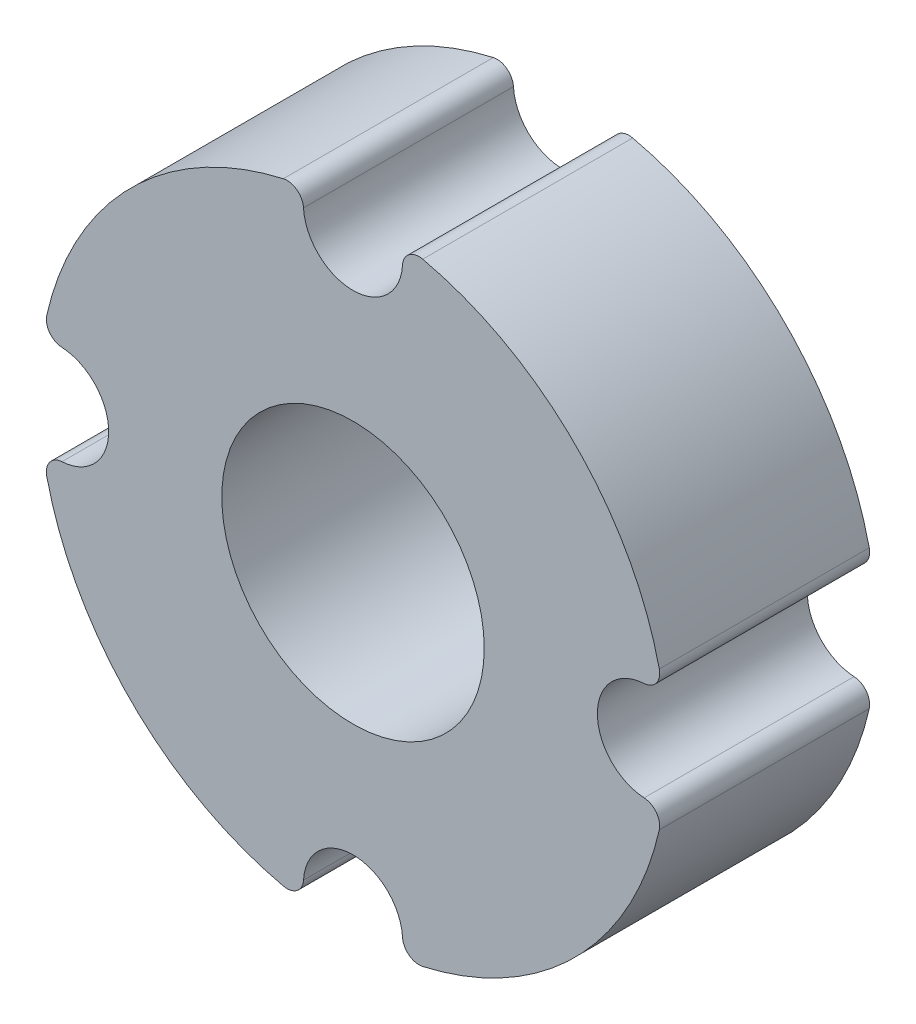
ISO-10303-21;
HEADER;
FILE_DESCRIPTION(('STEP AP214'),'2;1');
FILE_NAME('part.step','',(''),(''),'','','');
FILE_SCHEMA(('AUTOMOTIVE_DESIGN { 1 0 10303 214 1 1 1 1 }'));
ENDSEC;
DATA;
#1=APPLICATION_CONTEXT('core data for automotive mechanical design processes');
#2=APPLICATION_PROTOCOL_DEFINITION('international standard','automotive_design',2000,#1);
#3=PRODUCT_CONTEXT('',#1,'mechanical');
#4=PRODUCT('Part','Part','',(#3));
#5=PRODUCT_RELATED_PRODUCT_CATEGORY('part','',(#4));
#6=PRODUCT_DEFINITION_FORMATION('','',#4);
#7=PRODUCT_DEFINITION_CONTEXT('part definition',#1,'design');
#8=PRODUCT_DEFINITION('design','',#6,#7);
#9=PRODUCT_DEFINITION_SHAPE('','',#8);
#10=(LENGTH_UNIT() NAMED_UNIT(*) SI_UNIT(.MILLI.,.METRE.));
#11=(NAMED_UNIT(*) PLANE_ANGLE_UNIT() SI_UNIT($,.RADIAN.));
#12=(NAMED_UNIT(*) SI_UNIT($,.STERADIAN.) SOLID_ANGLE_UNIT());
#13=UNCERTAINTY_MEASURE_WITH_UNIT(LENGTH_MEASURE(1.E-05),#10,'distance_accuracy_value','');
#14=(GEOMETRIC_REPRESENTATION_CONTEXT(3) GLOBAL_UNCERTAINTY_ASSIGNED_CONTEXT((#13)) GLOBAL_UNIT_ASSIGNED_CONTEXT((#10,
#11,#12)) REPRESENTATION_CONTEXT('',''));
#15=CARTESIAN_POINT('',(0.,0.,0.));
#16=DIRECTION('',(0.,0.,1.));
#17=DIRECTION('',(1.,0.,0.));
#18=AXIS2_PLACEMENT_3D('',#15,#16,#17);
#19=CARTESIAN_POINT('',(0.,0.,6.35));
#20=DIRECTION('',(0.,0.,-1.));
#21=DIRECTION('',(-1.,0.,0.));
#22=AXIS2_PLACEMENT_3D('',#19,#20,#21);
#23=CYLINDRICAL_SURFACE('',#22,9.5);
#24=CARTESIAN_POINT('',(0.,0.,6.35));
#25=DIRECTION('',(0.,0.,1.));
#26=DIRECTION('',(1.,0.,0.));
#27=AXIS2_PLACEMENT_3D('',#24,#25,#26);
#28=CIRCLE('',#27,9.5);
#29=CARTESIAN_POINT('',(2.10766124104048,-9.26324803149606,6.35));
#30=VERTEX_POINT('',#29);
#31=CARTESIAN_POINT('',(9.26324803149608,-2.10766124104039,6.35));
#32=VERTEX_POINT('',#31);
#33=EDGE_CURVE('E174',#30,#32,#28,.T.);
#34=ORIENTED_EDGE('',*,*,#33,.F.);
#35=DIRECTION('',(0.,0.,-1.));
#36=VECTOR('',#35,1.);
#37=CARTESIAN_POINT('',(2.10766124104048,-9.26324803149607,6.35));
#38=LINE('',#37,#36);
#39=CARTESIAN_POINT('',(2.10766124104048,-9.26324803149606,0.));
#40=VERTEX_POINT('',#39);
#41=EDGE_CURVE('E158',#30,#40,#38,.T.);
#42=ORIENTED_EDGE('',*,*,#41,.T.);
#43=CARTESIAN_POINT('',(0.,0.,0.));
#44=DIRECTION('',(0.,0.,1.));
#45=DIRECTION('',(1.,0.,0.));
#46=AXIS2_PLACEMENT_3D('',#43,#44,#45);
#47=CIRCLE('',#46,9.5);
#48=CARTESIAN_POINT('',(9.26324803149608,-2.10766124104039,0.));
#49=VERTEX_POINT('',#48);
#50=EDGE_CURVE('E171',#40,#49,#47,.T.);
#51=ORIENTED_EDGE('',*,*,#50,.T.);
#52=DIRECTION('',(0.,0.,-1.));
#53=VECTOR('',#52,1.);
#54=CARTESIAN_POINT('',(9.26324803149608,-2.10766124104039,6.35));
#55=LINE('',#54,#53);
#56=EDGE_CURVE('E176',#49,#32,#55,.F.);
#57=ORIENTED_EDGE('',*,*,#56,.T.);
#58=EDGE_LOOP('',(#34,#42,#51,#57));
#59=FACE_BOUND('',#58,.T.);
#60=ADVANCED_FACE('F39',(#59),#23,.T.);
#61=CARTESIAN_POINT('',(-9.26324803149606,-2.10766124104052,0.));
#62=VERTEX_POINT('',#61);
#63=CARTESIAN_POINT('',(-2.10766124104048,-9.26324803149606,0.));
#64=VERTEX_POINT('',#63);
#65=EDGE_CURVE('E183',#62,#64,#47,.T.);
#66=ORIENTED_EDGE('',*,*,#65,.T.);
#67=DIRECTION('',(0.,0.,-1.));
#68=VECTOR('',#67,1.);
#69=CARTESIAN_POINT('',(-2.10766124104048,-9.26324803149607,6.35));
#70=LINE('',#69,#68);
#71=CARTESIAN_POINT('',(-2.10766124104048,-9.26324803149606,6.35));
#72=VERTEX_POINT('',#71);
#73=EDGE_CURVE('E219',#64,#72,#70,.F.);
#74=ORIENTED_EDGE('',*,*,#73,.T.);
#75=CARTESIAN_POINT('',(-9.26324803149606,-2.10766124104052,6.35));
#76=VERTEX_POINT('',#75);
#77=EDGE_CURVE('E202',#76,#72,#28,.T.);
#78=ORIENTED_EDGE('',*,*,#77,.F.);
#79=DIRECTION('',(0.,0.,-1.));
#80=VECTOR('',#79,1.);
#81=CARTESIAN_POINT('',(-9.26324803149606,-2.10766124104052,6.35));
#82=LINE('',#81,#80);
#83=EDGE_CURVE('E217',#76,#62,#82,.T.);
#84=ORIENTED_EDGE('',*,*,#83,.T.);
#85=EDGE_LOOP('',(#66,#74,#78,#84));
#86=FACE_BOUND('',#85,.T.);
#87=ADVANCED_FACE('F216',(#86),#23,.T.);
#88=CARTESIAN_POINT('',(-2.10766124104048,9.26324803149606,0.));
#89=VERTEX_POINT('',#88);
#90=CARTESIAN_POINT('',(-9.26324803149607,2.10766124104045,0.));
#91=VERTEX_POINT('',#90);
#92=EDGE_CURVE('E186',#89,#91,#47,.T.);
#93=ORIENTED_EDGE('',*,*,#92,.T.);
#94=DIRECTION('',(0.,0.,-1.));
#95=VECTOR('',#94,1.);
#96=CARTESIAN_POINT('',(-9.26324803149607,2.10766124104045,6.35));
#97=LINE('',#96,#95);
#98=CARTESIAN_POINT('',(-9.26324803149607,2.10766124104045,6.35));
#99=VERTEX_POINT('',#98);
#100=EDGE_CURVE('E232',#91,#99,#97,.F.);
#101=ORIENTED_EDGE('',*,*,#100,.T.);
#102=CARTESIAN_POINT('',(-2.10766124104048,9.26324803149606,6.35));
#103=VERTEX_POINT('',#102);
#104=EDGE_CURVE('E200',#103,#99,#28,.T.);
#105=ORIENTED_EDGE('',*,*,#104,.F.);
#106=DIRECTION('',(0.,0.,-1.));
#107=VECTOR('',#106,1.);
#108=CARTESIAN_POINT('',(-2.10766124104048,9.26324803149607,6.35));
#109=LINE('',#108,#107);
#110=EDGE_CURVE('E226',#103,#89,#109,.T.);
#111=ORIENTED_EDGE('',*,*,#110,.T.);
#112=EDGE_LOOP('',(#93,#101,#105,#111));
#113=FACE_BOUND('',#112,.T.);
#114=ADVANCED_FACE('F311',(#113),#23,.T.);
#115=CARTESIAN_POINT('',(0.,0.,6.35));
#116=DIRECTION('',(0.,0.,1.));
#117=DIRECTION('',(1.,0.,0.));
#118=AXIS2_PLACEMENT_3D('',#115,#116,#117);
#119=PLANE('',#118);
#120=CARTESIAN_POINT('',(0.,-8.89,6.35));
#121=DIRECTION('',(0.,0.,1.));
#122=DIRECTION('',(1.,0.,0.));
#123=AXIS2_PLACEMENT_3D('',#120,#121,#122);
#124=CIRCLE('',#123,1.5);
#125=CARTESIAN_POINT('',(1.49754877652876,-8.80428149606299,6.35));
#126=VERTEX_POINT('',#125);
#127=CARTESIAN_POINT('',(-1.49754877652876,-8.80428149606299,6.35));
#128=VERTEX_POINT('',#127);
#129=EDGE_CURVE('E291',#126,#128,#124,.T.);
#130=ORIENTED_EDGE('',*,*,#129,.F.);
#131=CARTESIAN_POINT('',(1.99673170203835,-8.77570866141732,6.35));
#132=DIRECTION('',(0.,0.,1.));
#133=DIRECTION('',(1.,0.,0.));
#134=AXIS2_PLACEMENT_3D('',#131,#132,#133);
#135=CIRCLE('',#134,0.5);
#136=EDGE_CURVE('E224',#126,#30,#135,.T.);
#137=ORIENTED_EDGE('',*,*,#136,.T.);
#138=ORIENTED_EDGE('',*,*,#33,.T.);
#139=CARTESIAN_POINT('',(8.77570866141734,-1.99673170203826,6.35));
#140=DIRECTION('',(0.,0.,1.));
#141=DIRECTION('',(1.,0.,0.));
#142=AXIS2_PLACEMENT_3D('',#139,#140,#141);
#143=CIRCLE('',#142,0.5);
#144=CARTESIAN_POINT('',(8.80428149606301,-1.49754877652867,6.35));
#145=VERTEX_POINT('',#144);
#146=EDGE_CURVE('E271',#32,#145,#143,.T.);
#147=ORIENTED_EDGE('',*,*,#146,.T.);
#148=CARTESIAN_POINT('',(8.89,0.,6.35));
#149=DIRECTION('',(0.,0.,1.));
#150=DIRECTION('',(1.,0.,0.));
#151=AXIS2_PLACEMENT_3D('',#148,#149,#150);
#152=CIRCLE('',#151,1.5);
#153=CARTESIAN_POINT('',(8.80428149606298,1.49754877652886,6.35));
#154=VERTEX_POINT('',#153);
#155=EDGE_CURVE('E341',#154,#145,#152,.T.);
#156=ORIENTED_EDGE('',*,*,#155,.F.);
#157=CARTESIAN_POINT('',(8.7757086614173,1.99673170203844,6.35));
#158=DIRECTION('',(0.,0.,1.));
#159=DIRECTION('',(1.,0.,0.));
#160=AXIS2_PLACEMENT_3D('',#157,#158,#159);
#161=CIRCLE('',#160,0.5);
#162=CARTESIAN_POINT('',(9.26324803149604,2.10766124104058,6.35));
#163=VERTEX_POINT('',#162);
#164=EDGE_CURVE('E265',#154,#163,#161,.T.);
#165=ORIENTED_EDGE('',*,*,#164,.T.);
#166=CARTESIAN_POINT('',(2.10766124104048,9.26324803149606,6.35));
#167=VERTEX_POINT('',#166);
#168=EDGE_CURVE('E193',#163,#167,#28,.T.);
#169=ORIENTED_EDGE('',*,*,#168,.T.);
#170=CARTESIAN_POINT('',(1.99673170203835,8.77570866141732,6.35));
#171=DIRECTION('',(0.,0.,1.));
#172=DIRECTION('',(1.,0.,0.));
#173=AXIS2_PLACEMENT_3D('',#170,#171,#172);
#174=CIRCLE('',#173,0.5);
#175=CARTESIAN_POINT('',(1.49754877652876,8.80428149606299,6.35));
#176=VERTEX_POINT('',#175);
#177=EDGE_CURVE('E260',#167,#176,#174,.T.);
#178=ORIENTED_EDGE('',*,*,#177,.T.);
#179=CARTESIAN_POINT('',(0.,8.89,6.35));
#180=DIRECTION('',(0.,0.,1.));
#181=DIRECTION('',(1.,0.,0.));
#182=AXIS2_PLACEMENT_3D('',#179,#180,#181);
#183=CIRCLE('',#182,1.5);
#184=CARTESIAN_POINT('',(-1.49754877652876,8.80428149606299,6.35));
#185=VERTEX_POINT('',#184);
#186=EDGE_CURVE('E253',#185,#176,#183,.T.);
#187=ORIENTED_EDGE('',*,*,#186,.F.);
#188=CARTESIAN_POINT('',(-1.99673170203835,8.77570866141732,6.35));
#189=DIRECTION('',(0.,0.,1.));
#190=DIRECTION('',(1.,0.,0.));
#191=AXIS2_PLACEMENT_3D('',#188,#189,#190);
#192=CIRCLE('',#191,0.5);
#193=EDGE_CURVE('E259',#185,#103,#192,.T.);
#194=ORIENTED_EDGE('',*,*,#193,.T.);
#195=ORIENTED_EDGE('',*,*,#104,.T.);
#196=CARTESIAN_POINT('',(-8.77570866141733,1.99673170203832,6.35));
#197=DIRECTION('',(0.,0.,1.));
#198=DIRECTION('',(1.,0.,0.));
#199=AXIS2_PLACEMENT_3D('',#196,#197,#198);
#200=CIRCLE('',#199,0.5);
#201=CARTESIAN_POINT('',(-8.804281496063,1.49754877652873,6.35));
#202=VERTEX_POINT('',#201);
#203=EDGE_CURVE('E274',#99,#202,#200,.T.);
#204=ORIENTED_EDGE('',*,*,#203,.T.);
#205=CARTESIAN_POINT('',(-8.89,0.,6.35));
#206=DIRECTION('',(0.,0.,1.));
#207=DIRECTION('',(1.,0.,0.));
#208=AXIS2_PLACEMENT_3D('',#205,#206,#207);
#209=CIRCLE('',#208,1.5);
#210=CARTESIAN_POINT('',(-8.80428149606299,-1.4975487765288,6.35));
#211=VERTEX_POINT('',#210);
#212=EDGE_CURVE('E205',#211,#202,#209,.T.);
#213=ORIENTED_EDGE('',*,*,#212,.F.);
#214=CARTESIAN_POINT('',(-8.77570866141732,-1.99673170203838,6.35));
#215=DIRECTION('',(0.,0.,1.));
#216=DIRECTION('',(1.,0.,0.));
#217=AXIS2_PLACEMENT_3D('',#214,#215,#216);
#218=CIRCLE('',#217,0.5);
#219=EDGE_CURVE('E62',#211,#76,#218,.T.);
#220=ORIENTED_EDGE('',*,*,#219,.T.);
#221=ORIENTED_EDGE('',*,*,#77,.T.);
#222=CARTESIAN_POINT('',(-1.99673170203835,-8.77570866141732,6.35));
#223=DIRECTION('',(0.,0.,1.));
#224=DIRECTION('',(1.,0.,0.));
#225=AXIS2_PLACEMENT_3D('',#222,#223,#224);
#226=CIRCLE('',#225,0.5);
#227=EDGE_CURVE('E54',#72,#128,#226,.T.);
#228=ORIENTED_EDGE('',*,*,#227,.T.);
#229=EDGE_LOOP('',(#130,#137,#138,#147,#156,#165,#169,#178,#187,#194,#195,#204,#213,#220,#221,#228));
#230=FACE_BOUND('',#229,.T.);
#231=CARTESIAN_POINT('',(0.,0.,6.35));
#232=DIRECTION('',(0.,0.,1.));
#233=DIRECTION('',(1.,0.,0.));
#234=AXIS2_PLACEMENT_3D('',#231,#232,#233);
#235=CIRCLE('',#234,3.96875);
#236=CARTESIAN_POINT('',(3.96875,0.,6.35));
#237=VERTEX_POINT('',#236);
#238=EDGE_CURVE('E189',#237,#237,#235,.T.);
#239=ORIENTED_EDGE('',*,*,#238,.F.);
#240=EDGE_LOOP('',(#239));
#241=FACE_BOUND('',#240,.T.);
#242=ADVANCED_FACE('F210',(#230,#241),#119,.T.);
#243=CARTESIAN_POINT('',(0.,0.,0.));
#244=DIRECTION('',(0.,0.,1.));
#245=DIRECTION('',(1.,0.,0.));
#246=AXIS2_PLACEMENT_3D('',#243,#244,#245);
#247=PLANE('',#246);
#248=ORIENTED_EDGE('',*,*,#50,.F.);
#249=CARTESIAN_POINT('',(1.99673170203835,-8.77570866141732,0.));
#250=DIRECTION('',(0.,0.,1.));
#251=DIRECTION('',(1.,0.,0.));
#252=AXIS2_PLACEMENT_3D('',#249,#250,#251);
#253=CIRCLE('',#252,0.5);
#254=CARTESIAN_POINT('',(1.49754877652876,-8.80428149606299,0.));
#255=VERTEX_POINT('',#254);
#256=EDGE_CURVE('E154',#40,#255,#253,.F.);
#257=ORIENTED_EDGE('',*,*,#256,.T.);
#258=CARTESIAN_POINT('',(0.,-8.89,0.));
#259=DIRECTION('',(0.,0.,1.));
#260=DIRECTION('',(1.,0.,0.));
#261=AXIS2_PLACEMENT_3D('',#258,#259,#260);
#262=CIRCLE('',#261,1.5);
#263=CARTESIAN_POINT('',(-1.49754877652876,-8.80428149606299,0.));
#264=VERTEX_POINT('',#263);
#265=EDGE_CURVE('E290',#255,#264,#262,.T.);
#266=ORIENTED_EDGE('',*,*,#265,.T.);
#267=CARTESIAN_POINT('',(-1.99673170203835,-8.77570866141732,0.));
#268=DIRECTION('',(0.,0.,1.));
#269=DIRECTION('',(1.,0.,0.));
#270=AXIS2_PLACEMENT_3D('',#267,#268,#269);
#271=CIRCLE('',#270,0.5);
#272=EDGE_CURVE('E165',#264,#64,#271,.F.);
#273=ORIENTED_EDGE('',*,*,#272,.T.);
#274=ORIENTED_EDGE('',*,*,#65,.F.);
#275=CARTESIAN_POINT('',(-8.77570866141732,-1.99673170203838,0.));
#276=DIRECTION('',(0.,0.,1.));
#277=DIRECTION('',(1.,0.,0.));
#278=AXIS2_PLACEMENT_3D('',#275,#276,#277);
#279=CIRCLE('',#278,0.5);
#280=CARTESIAN_POINT('',(-8.80428149606299,-1.49754877652879,0.));
#281=VERTEX_POINT('',#280);
#282=EDGE_CURVE('E223',#62,#281,#279,.F.);
#283=ORIENTED_EDGE('',*,*,#282,.T.);
#284=CARTESIAN_POINT('',(-8.89,0.,0.));
#285=DIRECTION('',(0.,0.,1.));
#286=DIRECTION('',(1.,0.,0.));
#287=AXIS2_PLACEMENT_3D('',#284,#285,#286);
#288=CIRCLE('',#287,1.5);
#289=CARTESIAN_POINT('',(-8.804281496063,1.49754877652873,0.));
#290=VERTEX_POINT('',#289);
#291=EDGE_CURVE('E261',#281,#290,#288,.T.);
#292=ORIENTED_EDGE('',*,*,#291,.T.);
#293=CARTESIAN_POINT('',(-8.77570866141733,1.99673170203832,0.));
#294=DIRECTION('',(0.,0.,1.));
#295=DIRECTION('',(1.,0.,0.));
#296=AXIS2_PLACEMENT_3D('',#293,#294,#295);
#297=CIRCLE('',#296,0.5);
#298=EDGE_CURVE('E283',#290,#91,#297,.F.);
#299=ORIENTED_EDGE('',*,*,#298,.T.);
#300=ORIENTED_EDGE('',*,*,#92,.F.);
#301=CARTESIAN_POINT('',(-1.99673170203835,8.77570866141732,0.));
#302=DIRECTION('',(0.,0.,1.));
#303=DIRECTION('',(1.,0.,0.));
#304=AXIS2_PLACEMENT_3D('',#301,#302,#303);
#305=CIRCLE('',#304,0.5);
#306=CARTESIAN_POINT('',(-1.49754877652876,8.80428149606299,0.));
#307=VERTEX_POINT('',#306);
#308=EDGE_CURVE('E175',#89,#307,#305,.F.);
#309=ORIENTED_EDGE('',*,*,#308,.T.);
#310=CARTESIAN_POINT('',(0.,8.89,0.));
#311=DIRECTION('',(0.,0.,1.));
#312=DIRECTION('',(1.,0.,0.));
#313=AXIS2_PLACEMENT_3D('',#310,#311,#312);
#314=CIRCLE('',#313,1.5);
#315=CARTESIAN_POINT('',(1.49754877652876,8.80428149606299,0.));
#316=VERTEX_POINT('',#315);
#317=EDGE_CURVE('E256',#307,#316,#314,.T.);
#318=ORIENTED_EDGE('',*,*,#317,.T.);
#319=CARTESIAN_POINT('',(1.99673170203835,8.77570866141732,0.));
#320=DIRECTION('',(0.,0.,1.));
#321=DIRECTION('',(1.,0.,0.));
#322=AXIS2_PLACEMENT_3D('',#319,#320,#321);
#323=CIRCLE('',#322,0.5);
#324=CARTESIAN_POINT('',(2.10766124104048,9.26324803149606,0.));
#325=VERTEX_POINT('',#324);
#326=EDGE_CURVE('E351',#316,#325,#323,.F.);
#327=ORIENTED_EDGE('',*,*,#326,.T.);
#328=CARTESIAN_POINT('',(9.26324803149604,2.10766124104058,0.));
#329=VERTEX_POINT('',#328);
#330=EDGE_CURVE('E184',#329,#325,#47,.T.);
#331=ORIENTED_EDGE('',*,*,#330,.F.);
#332=CARTESIAN_POINT('',(8.7757086614173,1.99673170203844,0.));
#333=DIRECTION('',(0.,0.,1.));
#334=DIRECTION('',(1.,0.,0.));
#335=AXIS2_PLACEMENT_3D('',#332,#333,#334);
#336=CIRCLE('',#335,0.5);
#337=CARTESIAN_POINT('',(8.80428149606298,1.49754877652886,0.));
#338=VERTEX_POINT('',#337);
#339=EDGE_CURVE('E350',#329,#338,#336,.F.);
#340=ORIENTED_EDGE('',*,*,#339,.T.);
#341=CARTESIAN_POINT('',(8.89,0.,0.));
#342=DIRECTION('',(0.,0.,1.));
#343=DIRECTION('',(1.,0.,0.));
#344=AXIS2_PLACEMENT_3D('',#341,#342,#343);
#345=CIRCLE('',#344,1.5);
#346=CARTESIAN_POINT('',(8.80428149606301,-1.49754877652867,0.));
#347=VERTEX_POINT('',#346);
#348=EDGE_CURVE('E346',#338,#347,#345,.T.);
#349=ORIENTED_EDGE('',*,*,#348,.T.);
#350=CARTESIAN_POINT('',(8.77570866141734,-1.99673170203826,0.));
#351=DIRECTION('',(0.,0.,1.));
#352=DIRECTION('',(1.,0.,0.));
#353=AXIS2_PLACEMENT_3D('',#350,#351,#352);
#354=CIRCLE('',#353,0.5);
#355=EDGE_CURVE('E182',#347,#49,#354,.F.);
#356=ORIENTED_EDGE('',*,*,#355,.T.);
#357=EDGE_LOOP('',(#248,#257,#266,#273,#274,#283,#292,#299,#300,#309,#318,#327,#331,#340,#349,#356));
#358=FACE_BOUND('',#357,.T.);
#359=CARTESIAN_POINT('',(0.,0.,0.));
#360=DIRECTION('',(0.,0.,1.));
#361=DIRECTION('',(1.,0.,0.));
#362=AXIS2_PLACEMENT_3D('',#359,#360,#361);
#363=CIRCLE('',#362,3.96875);
#364=CARTESIAN_POINT('',(3.96875,0.,0.));
#365=VERTEX_POINT('',#364);
#366=EDGE_CURVE('E360',#365,#365,#363,.T.);
#367=ORIENTED_EDGE('',*,*,#366,.T.);
#368=EDGE_LOOP('',(#367));
#369=FACE_BOUND('',#368,.T.);
#370=ADVANCED_FACE('F178',(#358,#369),#247,.F.);
#371=ORIENTED_EDGE('',*,*,#168,.F.);
#372=DIRECTION('',(0.,0.,-1.));
#373=VECTOR('',#372,1.);
#374=CARTESIAN_POINT('',(9.26324803149604,2.10766124104058,6.35));
#375=LINE('',#374,#373);
#376=EDGE_CURVE('E245',#163,#329,#375,.T.);
#377=ORIENTED_EDGE('',*,*,#376,.T.);
#378=ORIENTED_EDGE('',*,*,#330,.T.);
#379=DIRECTION('',(0.,0.,-1.));
#380=VECTOR('',#379,1.);
#381=CARTESIAN_POINT('',(2.10766124104048,9.26324803149607,6.35));
#382=LINE('',#381,#380);
#383=EDGE_CURVE('E242',#325,#167,#382,.F.);
#384=ORIENTED_EDGE('',*,*,#383,.T.);
#385=EDGE_LOOP('',(#371,#377,#378,#384));
#386=FACE_BOUND('',#385,.T.);
#387=ADVANCED_FACE('F306',(#386),#23,.T.);
#388=CARTESIAN_POINT('',(0.,0.,6.35));
#389=DIRECTION('',(0.,0.,-1.));
#390=DIRECTION('',(-1.,0.,0.));
#391=AXIS2_PLACEMENT_3D('',#388,#389,#390);
#392=CYLINDRICAL_SURFACE('',#391,3.96875);
#393=ORIENTED_EDGE('',*,*,#238,.T.);
#394=EDGE_LOOP('',(#393));
#395=FACE_BOUND('',#394,.T.);
#396=ORIENTED_EDGE('',*,*,#366,.F.);
#397=EDGE_LOOP('',(#396));
#398=FACE_BOUND('',#397,.T.);
#399=ADVANCED_FACE('F314',(#395,#398),#392,.F.);
#400=CARTESIAN_POINT('',(0.,8.89,6.35));
#401=DIRECTION('',(0.,0.,1.));
#402=DIRECTION('',(1.,0.,0.));
#403=AXIS2_PLACEMENT_3D('',#400,#401,#402);
#404=CYLINDRICAL_SURFACE('',#403,1.5);
#405=ORIENTED_EDGE('',*,*,#186,.T.);
#406=DIRECTION('',(0.,0.,1.));
#407=VECTOR('',#406,1.);
#408=CARTESIAN_POINT('',(1.49754877652876,8.80428149606299,6.35));
#409=LINE('',#408,#407);
#410=EDGE_CURVE('E11',#176,#316,#409,.F.);
#411=ORIENTED_EDGE('',*,*,#410,.T.);
#412=ORIENTED_EDGE('',*,*,#317,.F.);
#413=DIRECTION('',(0.,0.,1.));
#414=VECTOR('',#413,1.);
#415=CARTESIAN_POINT('',(-1.49754877652876,8.80428149606299,6.35));
#416=LINE('',#415,#414);
#417=EDGE_CURVE('E47',#307,#185,#416,.T.);
#418=ORIENTED_EDGE('',*,*,#417,.T.);
#419=EDGE_LOOP('',(#405,#411,#412,#418));
#420=FACE_BOUND('',#419,.T.);
#421=ADVANCED_FACE('F252',(#420),#404,.F.);
#422=CARTESIAN_POINT('',(-8.89,0.,6.35));
#423=DIRECTION('',(0.,0.,1.));
#424=DIRECTION('',(1.,0.,0.));
#425=AXIS2_PLACEMENT_3D('',#422,#423,#424);
#426=CYLINDRICAL_SURFACE('',#425,1.5);
#427=ORIENTED_EDGE('',*,*,#212,.T.);
#428=DIRECTION('',(0.,0.,1.));
#429=VECTOR('',#428,1.);
#430=CARTESIAN_POINT('',(-8.804281496063,1.49754877652873,6.35));
#431=LINE('',#430,#429);
#432=EDGE_CURVE('E236',#202,#290,#431,.F.);
#433=ORIENTED_EDGE('',*,*,#432,.T.);
#434=ORIENTED_EDGE('',*,*,#291,.F.);
#435=DIRECTION('',(0.,0.,1.));
#436=VECTOR('',#435,1.);
#437=CARTESIAN_POINT('',(-8.80428149606299,-1.49754877652879,6.35));
#438=LINE('',#437,#436);
#439=EDGE_CURVE('E234',#281,#211,#438,.T.);
#440=ORIENTED_EDGE('',*,*,#439,.T.);
#441=EDGE_LOOP('',(#427,#433,#434,#440));
#442=FACE_BOUND('',#441,.T.);
#443=ADVANCED_FACE('F278',(#442),#426,.F.);
#444=CARTESIAN_POINT('',(0.,-8.89,6.35));
#445=DIRECTION('',(0.,0.,1.));
#446=DIRECTION('',(1.,0.,0.));
#447=AXIS2_PLACEMENT_3D('',#444,#445,#446);
#448=CYLINDRICAL_SURFACE('',#447,1.5);
#449=ORIENTED_EDGE('',*,*,#265,.F.);
#450=DIRECTION('',(0.,0.,1.));
#451=VECTOR('',#450,1.);
#452=CARTESIAN_POINT('',(1.49754877652876,-8.80428149606299,6.35));
#453=LINE('',#452,#451);
#454=EDGE_CURVE('E159',#255,#126,#453,.T.);
#455=ORIENTED_EDGE('',*,*,#454,.T.);
#456=ORIENTED_EDGE('',*,*,#129,.T.);
#457=DIRECTION('',(0.,0.,1.));
#458=VECTOR('',#457,1.);
#459=CARTESIAN_POINT('',(-1.49754877652876,-8.80428149606299,6.35));
#460=LINE('',#459,#458);
#461=EDGE_CURVE('E164',#128,#264,#460,.F.);
#462=ORIENTED_EDGE('',*,*,#461,.T.);
#463=EDGE_LOOP('',(#449,#455,#456,#462));
#464=FACE_BOUND('',#463,.T.);
#465=ADVANCED_FACE('F289',(#464),#448,.F.);
#466=CARTESIAN_POINT('',(8.89,0.,6.35));
#467=DIRECTION('',(0.,0.,1.));
#468=DIRECTION('',(1.,0.,0.));
#469=AXIS2_PLACEMENT_3D('',#466,#467,#468);
#470=CYLINDRICAL_SURFACE('',#469,1.5);
#471=ORIENTED_EDGE('',*,*,#155,.T.);
#472=DIRECTION('',(0.,0.,1.));
#473=VECTOR('',#472,1.);
#474=CARTESIAN_POINT('',(8.80428149606301,-1.49754877652867,6.35));
#475=LINE('',#474,#473);
#476=EDGE_CURVE('E240',#145,#347,#475,.F.);
#477=ORIENTED_EDGE('',*,*,#476,.T.);
#478=ORIENTED_EDGE('',*,*,#348,.F.);
#479=DIRECTION('',(0.,0.,1.));
#480=VECTOR('',#479,1.);
#481=CARTESIAN_POINT('',(8.80428149606298,1.49754877652886,6.35));
#482=LINE('',#481,#480);
#483=EDGE_CURVE('E238',#338,#154,#482,.T.);
#484=ORIENTED_EDGE('',*,*,#483,.T.);
#485=EDGE_LOOP('',(#471,#477,#478,#484));
#486=FACE_BOUND('',#485,.T.);
#487=ADVANCED_FACE('F302',(#486),#470,.F.);
#488=CARTESIAN_POINT('',(1.99673170203835,-8.77570866141732,6.35));
#489=DIRECTION('',(0.,0.,1.));
#490=DIRECTION('',(1.,0.,0.));
#491=AXIS2_PLACEMENT_3D('',#488,#489,#490);
#492=CYLINDRICAL_SURFACE('',#491,0.5);
#493=ORIENTED_EDGE('',*,*,#136,.F.);
#494=ORIENTED_EDGE('',*,*,#454,.F.);
#495=ORIENTED_EDGE('',*,*,#256,.F.);
#496=ORIENTED_EDGE('',*,*,#41,.F.);
#497=EDGE_LOOP('',(#493,#494,#495,#496));
#498=FACE_BOUND('',#497,.T.);
#499=ADVANCED_FACE('F157',(#498),#492,.T.);
#500=CARTESIAN_POINT('',(-1.99673170203835,-8.77570866141732,6.35));
#501=DIRECTION('',(0.,0.,-1.));
#502=DIRECTION('',(-1.,0.,0.));
#503=AXIS2_PLACEMENT_3D('',#500,#501,#502);
#504=CYLINDRICAL_SURFACE('',#503,0.5);
#505=ORIENTED_EDGE('',*,*,#272,.F.);
#506=ORIENTED_EDGE('',*,*,#461,.F.);
#507=ORIENTED_EDGE('',*,*,#227,.F.);
#508=ORIENTED_EDGE('',*,*,#73,.F.);
#509=EDGE_LOOP('',(#505,#506,#507,#508));
#510=FACE_BOUND('',#509,.T.);
#511=ADVANCED_FACE('F294',(#510),#504,.T.);
#512=CARTESIAN_POINT('',(-8.77570866141733,1.99673170203832,6.35));
#513=DIRECTION('',(0.,0.,-1.));
#514=DIRECTION('',(-1.,0.,0.));
#515=AXIS2_PLACEMENT_3D('',#512,#513,#514);
#516=CYLINDRICAL_SURFACE('',#515,0.5);
#517=ORIENTED_EDGE('',*,*,#298,.F.);
#518=ORIENTED_EDGE('',*,*,#432,.F.);
#519=ORIENTED_EDGE('',*,*,#203,.F.);
#520=ORIENTED_EDGE('',*,*,#100,.F.);
#521=EDGE_LOOP('',(#517,#518,#519,#520));
#522=FACE_BOUND('',#521,.T.);
#523=ADVANCED_FACE('F282',(#522),#516,.T.);
#524=CARTESIAN_POINT('',(-8.77570866141732,-1.99673170203838,6.35));
#525=DIRECTION('',(0.,0.,1.));
#526=DIRECTION('',(1.,0.,0.));
#527=AXIS2_PLACEMENT_3D('',#524,#525,#526);
#528=CYLINDRICAL_SURFACE('',#527,0.5);
#529=ORIENTED_EDGE('',*,*,#219,.F.);
#530=ORIENTED_EDGE('',*,*,#439,.F.);
#531=ORIENTED_EDGE('',*,*,#282,.F.);
#532=ORIENTED_EDGE('',*,*,#83,.F.);
#533=EDGE_LOOP('',(#529,#530,#531,#532));
#534=FACE_BOUND('',#533,.T.);
#535=ADVANCED_FACE('F221',(#534),#528,.T.);
#536=CARTESIAN_POINT('',(8.77570866141734,-1.99673170203826,6.35));
#537=DIRECTION('',(0.,0.,-1.));
#538=DIRECTION('',(-1.,0.,0.));
#539=AXIS2_PLACEMENT_3D('',#536,#537,#538);
#540=CYLINDRICAL_SURFACE('',#539,0.5);
#541=ORIENTED_EDGE('',*,*,#355,.F.);
#542=ORIENTED_EDGE('',*,*,#476,.F.);
#543=ORIENTED_EDGE('',*,*,#146,.F.);
#544=ORIENTED_EDGE('',*,*,#56,.F.);
#545=EDGE_LOOP('',(#541,#542,#543,#544));
#546=FACE_BOUND('',#545,.T.);
#547=ADVANCED_FACE('F349',(#546),#540,.T.);
#548=CARTESIAN_POINT('',(8.7757086614173,1.99673170203844,6.35));
#549=DIRECTION('',(0.,0.,1.));
#550=DIRECTION('',(1.,0.,0.));
#551=AXIS2_PLACEMENT_3D('',#548,#549,#550);
#552=CYLINDRICAL_SURFACE('',#551,0.5);
#553=ORIENTED_EDGE('',*,*,#164,.F.);
#554=ORIENTED_EDGE('',*,*,#483,.F.);
#555=ORIENTED_EDGE('',*,*,#339,.F.);
#556=ORIENTED_EDGE('',*,*,#376,.F.);
#557=EDGE_LOOP('',(#553,#554,#555,#556));
#558=FACE_BOUND('',#557,.T.);
#559=ADVANCED_FACE('F373',(#558),#552,.T.);
#560=CARTESIAN_POINT('',(1.99673170203835,8.77570866141732,6.35));
#561=DIRECTION('',(0.,0.,-1.));
#562=DIRECTION('',(-1.,0.,0.));
#563=AXIS2_PLACEMENT_3D('',#560,#561,#562);
#564=CYLINDRICAL_SURFACE('',#563,0.5);
#565=ORIENTED_EDGE('',*,*,#326,.F.);
#566=ORIENTED_EDGE('',*,*,#410,.F.);
#567=ORIENTED_EDGE('',*,*,#177,.F.);
#568=ORIENTED_EDGE('',*,*,#383,.F.);
#569=EDGE_LOOP('',(#565,#566,#567,#568));
#570=FACE_BOUND('',#569,.T.);
#571=ADVANCED_FACE('F370',(#570),#564,.T.);
#572=CARTESIAN_POINT('',(-1.99673170203835,8.77570866141732,6.35));
#573=DIRECTION('',(0.,0.,1.));
#574=DIRECTION('',(1.,0.,0.));
#575=AXIS2_PLACEMENT_3D('',#572,#573,#574);
#576=CYLINDRICAL_SURFACE('',#575,0.5);
#577=ORIENTED_EDGE('',*,*,#193,.F.);
#578=ORIENTED_EDGE('',*,*,#417,.F.);
#579=ORIENTED_EDGE('',*,*,#308,.F.);
#580=ORIENTED_EDGE('',*,*,#110,.F.);
#581=EDGE_LOOP('',(#577,#578,#579,#580));
#582=FACE_BOUND('',#581,.T.);
#583=ADVANCED_FACE('F41',(#582),#576,.T.);
#584=CLOSED_SHELL('',(#60,#87,#114,#242,#370,#387,#399,#421,#443,#465,#487,#499,#511,#523,#535,
#547,#559,#571,#583));
#585=MANIFOLD_SOLID_BREP('B2',#584);
#586=ADVANCED_BREP_SHAPE_REPRESENTATION('',(#18,#585),#14);
#587=SHAPE_DEFINITION_REPRESENTATION(#9,#586);
ENDSEC;
END-ISO-10303-21;
